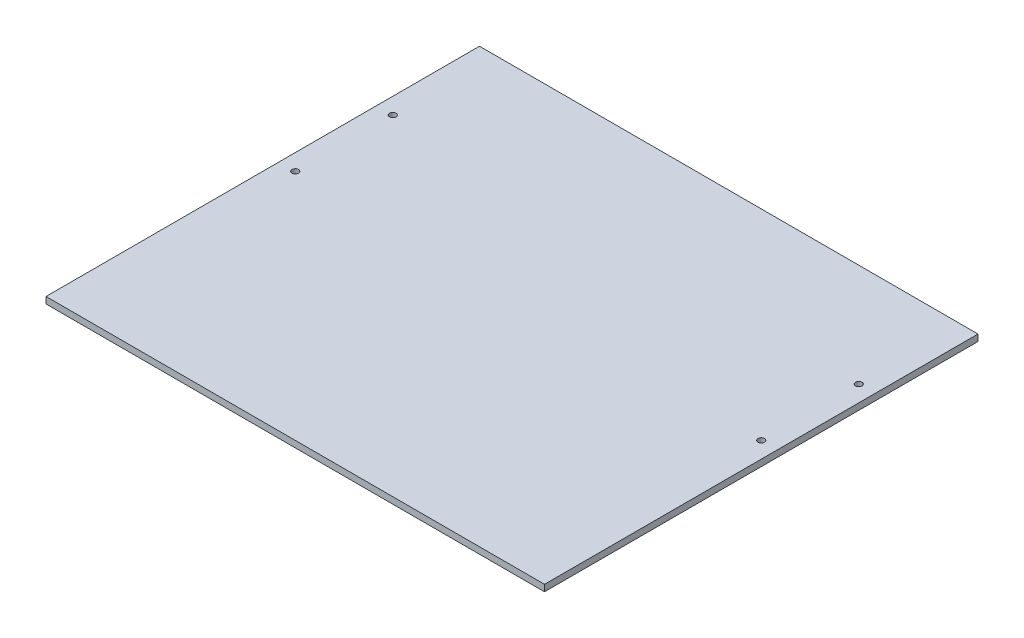
ISO-10303-21;
HEADER;
FILE_DESCRIPTION(('STEP AP214'),'2;1');
FILE_NAME('part.step','',(''),(''),'','','');
FILE_SCHEMA(('AUTOMOTIVE_DESIGN { 1 0 10303 214 1 1 1 1 }'));
ENDSEC;
DATA;
#1=APPLICATION_CONTEXT('core data for automotive mechanical design processes');
#2=APPLICATION_PROTOCOL_DEFINITION('international standard','automotive_design',2000,#1);
#3=PRODUCT_CONTEXT('',#1,'mechanical');
#4=PRODUCT('Part','Part','',(#3));
#5=PRODUCT_RELATED_PRODUCT_CATEGORY('part','',(#4));
#6=PRODUCT_DEFINITION_FORMATION('','',#4);
#7=PRODUCT_DEFINITION_CONTEXT('part definition',#1,'design');
#8=PRODUCT_DEFINITION('design','',#6,#7);
#9=PRODUCT_DEFINITION_SHAPE('','',#8);
#10=(LENGTH_UNIT() NAMED_UNIT(*) SI_UNIT(.MILLI.,.METRE.));
#11=(NAMED_UNIT(*) PLANE_ANGLE_UNIT() SI_UNIT($,.RADIAN.));
#12=(NAMED_UNIT(*) SI_UNIT($,.STERADIAN.) SOLID_ANGLE_UNIT());
#13=UNCERTAINTY_MEASURE_WITH_UNIT(LENGTH_MEASURE(1.E-05),#10,'distance_accuracy_value','');
#14=(GEOMETRIC_REPRESENTATION_CONTEXT(3) GLOBAL_UNCERTAINTY_ASSIGNED_CONTEXT((#13)) GLOBAL_UNIT_ASSIGNED_CONTEXT((#10,
#11,#12)) REPRESENTATION_CONTEXT('',''));
#15=CARTESIAN_POINT('',(0.,0.,0.));
#16=DIRECTION('',(0.,0.,1.));
#17=DIRECTION('',(1.,0.,0.));
#18=AXIS2_PLACEMENT_3D('',#15,#16,#17);
#19=CARTESIAN_POINT('',(0.,3.,0.));
#20=DIRECTION('',(0.,-1.,0.));
#21=DIRECTION('',(0.,0.,-1.));
#22=AXIS2_PLACEMENT_3D('',#19,#20,#21);
#23=PLANE('',#22);
#24=DIRECTION('',(0.,0.,-1.));
#25=VECTOR('',#24,1.);
#26=CARTESIAN_POINT('',(115.,3.,100.));
#27=LINE('',#26,#25);
#28=CARTESIAN_POINT('',(115.,3.,100.));
#29=VERTEX_POINT('',#28);
#30=CARTESIAN_POINT('',(115.,3.,-100.));
#31=VERTEX_POINT('',#30);
#32=EDGE_CURVE('E84',#29,#31,#27,.T.);
#33=ORIENTED_EDGE('',*,*,#32,.T.);
#34=DIRECTION('',(-1.,0.,0.));
#35=VECTOR('',#34,1.);
#36=CARTESIAN_POINT('',(-115.,3.,-100.));
#37=LINE('',#36,#35);
#38=CARTESIAN_POINT('',(-115.,3.,-100.));
#39=VERTEX_POINT('',#38);
#40=EDGE_CURVE('E79',#31,#39,#37,.T.);
#41=ORIENTED_EDGE('',*,*,#40,.T.);
#42=DIRECTION('',(0.,0.,1.));
#43=VECTOR('',#42,1.);
#44=CARTESIAN_POINT('',(-115.,3.,100.));
#45=LINE('',#44,#43);
#46=CARTESIAN_POINT('',(-115.,3.,100.));
#47=VERTEX_POINT('',#46);
#48=EDGE_CURVE('E82',#39,#47,#45,.T.);
#49=ORIENTED_EDGE('',*,*,#48,.T.);
#50=DIRECTION('',(1.,0.,0.));
#51=VECTOR('',#50,1.);
#52=CARTESIAN_POINT('',(-115.,3.,100.));
#53=LINE('',#52,#51);
#54=EDGE_CURVE('E49',#47,#29,#53,.T.);
#55=ORIENTED_EDGE('',*,*,#54,.T.);
#56=EDGE_LOOP('',(#33,#41,#49,#55));
#57=FACE_BOUND('',#56,.T.);
#58=CARTESIAN_POINT('',(-107.5,3.,-52.5));
#59=DIRECTION('',(0.,1.,0.));
#60=DIRECTION('',(0.,0.,1.));
#61=AXIS2_PLACEMENT_3D('',#58,#59,#60);
#62=CIRCLE('',#61,1.5);
#63=CARTESIAN_POINT('',(-107.5,3.,-51.));
#64=VERTEX_POINT('',#63);
#65=EDGE_CURVE('E99',#64,#64,#62,.T.);
#66=ORIENTED_EDGE('',*,*,#65,.F.);
#67=EDGE_LOOP('',(#66));
#68=FACE_BOUND('',#67,.T.);
#69=CARTESIAN_POINT('',(-107.5,3.,-7.49999999999997));
#70=DIRECTION('',(0.,1.,0.));
#71=DIRECTION('',(0.,0.,1.));
#72=AXIS2_PLACEMENT_3D('',#69,#70,#71);
#73=CIRCLE('',#72,1.5);
#74=CARTESIAN_POINT('',(-107.5,3.,-5.99999999999997));
#75=VERTEX_POINT('',#74);
#76=EDGE_CURVE('E114',#75,#75,#73,.T.);
#77=ORIENTED_EDGE('',*,*,#76,.F.);
#78=EDGE_LOOP('',(#77));
#79=FACE_BOUND('',#78,.T.);
#80=CARTESIAN_POINT('',(107.5,3.,-7.49999999999994));
#81=DIRECTION('',(0.,1.,0.));
#82=DIRECTION('',(0.,0.,-1.));
#83=AXIS2_PLACEMENT_3D('',#80,#81,#82);
#84=CIRCLE('',#83,1.5);
#85=CARTESIAN_POINT('',(107.5,3.,-8.99999999999994));
#86=VERTEX_POINT('',#85);
#87=EDGE_CURVE('E120',#86,#86,#84,.T.);
#88=ORIENTED_EDGE('',*,*,#87,.F.);
#89=EDGE_LOOP('',(#88));
#90=FACE_BOUND('',#89,.T.);
#91=CARTESIAN_POINT('',(107.5,3.,-52.5));
#92=DIRECTION('',(0.,1.,0.));
#93=DIRECTION('',(0.,0.,-1.));
#94=AXIS2_PLACEMENT_3D('',#91,#92,#93);
#95=CIRCLE('',#94,1.5);
#96=CARTESIAN_POINT('',(107.5,3.,-54.));
#97=VERTEX_POINT('',#96);
#98=EDGE_CURVE('E126',#97,#97,#95,.T.);
#99=ORIENTED_EDGE('',*,*,#98,.F.);
#100=EDGE_LOOP('',(#99));
#101=FACE_BOUND('',#100,.T.);
#102=ADVANCED_FACE('F32',(#57,#68,#79,#90,#101),#23,.F.);
#103=CARTESIAN_POINT('',(0.,0.,0.));
#104=DIRECTION('',(0.,-1.,0.));
#105=DIRECTION('',(0.,0.,-1.));
#106=AXIS2_PLACEMENT_3D('',#103,#104,#105);
#107=PLANE('',#106);
#108=CARTESIAN_POINT('',(107.5,0.,-7.49999999999994));
#109=DIRECTION('',(0.,1.,0.));
#110=DIRECTION('',(0.,0.,-1.));
#111=AXIS2_PLACEMENT_3D('',#108,#109,#110);
#112=CIRCLE('',#111,1.5);
#113=CARTESIAN_POINT('',(107.5,0.,-8.99999999999994));
#114=VERTEX_POINT('',#113);
#115=EDGE_CURVE('E123',#114,#114,#112,.T.);
#116=ORIENTED_EDGE('',*,*,#115,.T.);
#117=EDGE_LOOP('',(#116));
#118=FACE_BOUND('',#117,.T.);
#119=CARTESIAN_POINT('',(-107.5,0.,-52.5));
#120=DIRECTION('',(0.,1.,0.));
#121=DIRECTION('',(0.,0.,1.));
#122=AXIS2_PLACEMENT_3D('',#119,#120,#121);
#123=CIRCLE('',#122,1.5);
#124=CARTESIAN_POINT('',(-107.5,0.,-51.));
#125=VERTEX_POINT('',#124);
#126=EDGE_CURVE('E111',#125,#125,#123,.T.);
#127=ORIENTED_EDGE('',*,*,#126,.T.);
#128=EDGE_LOOP('',(#127));
#129=FACE_BOUND('',#128,.T.);
#130=DIRECTION('',(0.,0.,-1.));
#131=VECTOR('',#130,1.);
#132=CARTESIAN_POINT('',(115.,0.,100.));
#133=LINE('',#132,#131);
#134=CARTESIAN_POINT('',(115.,0.,100.));
#135=VERTEX_POINT('',#134);
#136=CARTESIAN_POINT('',(115.,0.,-100.));
#137=VERTEX_POINT('',#136);
#138=EDGE_CURVE('E96',#135,#137,#133,.T.);
#139=ORIENTED_EDGE('',*,*,#138,.F.);
#140=DIRECTION('',(1.,0.,0.));
#141=VECTOR('',#140,1.);
#142=CARTESIAN_POINT('',(-115.,0.,100.));
#143=LINE('',#142,#141);
#144=CARTESIAN_POINT('',(-115.,0.,100.));
#145=VERTEX_POINT('',#144);
#146=EDGE_CURVE('E72',#145,#135,#143,.T.);
#147=ORIENTED_EDGE('',*,*,#146,.F.);
#148=DIRECTION('',(0.,0.,1.));
#149=VECTOR('',#148,1.);
#150=CARTESIAN_POINT('',(-115.,0.,100.));
#151=LINE('',#150,#149);
#152=CARTESIAN_POINT('',(-115.,0.,-100.));
#153=VERTEX_POINT('',#152);
#154=EDGE_CURVE('E66',#153,#145,#151,.T.);
#155=ORIENTED_EDGE('',*,*,#154,.F.);
#156=DIRECTION('',(-1.,0.,0.));
#157=VECTOR('',#156,1.);
#158=CARTESIAN_POINT('',(-115.,0.,-100.));
#159=LINE('',#158,#157);
#160=EDGE_CURVE('E88',#137,#153,#159,.T.);
#161=ORIENTED_EDGE('',*,*,#160,.F.);
#162=EDGE_LOOP('',(#139,#147,#155,#161));
#163=FACE_BOUND('',#162,.T.);
#164=CARTESIAN_POINT('',(-107.5,0.,-7.49999999999997));
#165=DIRECTION('',(0.,1.,0.));
#166=DIRECTION('',(0.,0.,1.));
#167=AXIS2_PLACEMENT_3D('',#164,#165,#166);
#168=CIRCLE('',#167,1.5);
#169=CARTESIAN_POINT('',(-107.5,0.,-5.99999999999997));
#170=VERTEX_POINT('',#169);
#171=EDGE_CURVE('E117',#170,#170,#168,.T.);
#172=ORIENTED_EDGE('',*,*,#171,.T.);
#173=EDGE_LOOP('',(#172));
#174=FACE_BOUND('',#173,.T.);
#175=CARTESIAN_POINT('',(107.5,0.,-52.5));
#176=DIRECTION('',(0.,1.,0.));
#177=DIRECTION('',(0.,0.,-1.));
#178=AXIS2_PLACEMENT_3D('',#175,#176,#177);
#179=CIRCLE('',#178,1.5);
#180=CARTESIAN_POINT('',(107.5,0.,-54.));
#181=VERTEX_POINT('',#180);
#182=EDGE_CURVE('E129',#181,#181,#179,.T.);
#183=ORIENTED_EDGE('',*,*,#182,.T.);
#184=EDGE_LOOP('',(#183));
#185=FACE_BOUND('',#184,.T.);
#186=ADVANCED_FACE('F107',(#118,#129,#163,#174,#185),#107,.T.);
#187=CARTESIAN_POINT('',(115.,3.,100.));
#188=DIRECTION('',(-1.,0.,0.));
#189=DIRECTION('',(0.,0.,1.));
#190=AXIS2_PLACEMENT_3D('',#187,#188,#189);
#191=PLANE('',#190);
#192=ORIENTED_EDGE('',*,*,#138,.T.);
#193=DIRECTION('',(0.,-1.,0.));
#194=VECTOR('',#193,1.);
#195=CARTESIAN_POINT('',(115.,3.,-100.));
#196=LINE('',#195,#194);
#197=EDGE_CURVE('E11',#31,#137,#196,.T.);
#198=ORIENTED_EDGE('',*,*,#197,.F.);
#199=ORIENTED_EDGE('',*,*,#32,.F.);
#200=DIRECTION('',(0.,-1.,0.));
#201=VECTOR('',#200,1.);
#202=CARTESIAN_POINT('',(115.,3.,100.));
#203=LINE('',#202,#201);
#204=EDGE_CURVE('E92',#29,#135,#203,.T.);
#205=ORIENTED_EDGE('',*,*,#204,.T.);
#206=EDGE_LOOP('',(#192,#198,#199,#205));
#207=FACE_BOUND('',#206,.T.);
#208=ADVANCED_FACE('F34',(#207),#191,.F.);
#209=CARTESIAN_POINT('',(-115.,3.,-100.));
#210=DIRECTION('',(0.,0.,1.));
#211=DIRECTION('',(1.,0.,0.));
#212=AXIS2_PLACEMENT_3D('',#209,#210,#211);
#213=PLANE('',#212);
#214=ORIENTED_EDGE('',*,*,#160,.T.);
#215=DIRECTION('',(0.,-1.,0.));
#216=VECTOR('',#215,1.);
#217=CARTESIAN_POINT('',(-115.,3.,-100.));
#218=LINE('',#217,#216);
#219=EDGE_CURVE('E41',#39,#153,#218,.T.);
#220=ORIENTED_EDGE('',*,*,#219,.F.);
#221=ORIENTED_EDGE('',*,*,#40,.F.);
#222=ORIENTED_EDGE('',*,*,#197,.T.);
#223=EDGE_LOOP('',(#214,#220,#221,#222));
#224=FACE_BOUND('',#223,.T.);
#225=ADVANCED_FACE('F87',(#224),#213,.F.);
#226=CARTESIAN_POINT('',(-115.,3.,100.));
#227=DIRECTION('',(1.,0.,0.));
#228=DIRECTION('',(0.,0.,-1.));
#229=AXIS2_PLACEMENT_3D('',#226,#227,#228);
#230=PLANE('',#229);
#231=ORIENTED_EDGE('',*,*,#154,.T.);
#232=DIRECTION('',(0.,-1.,0.));
#233=VECTOR('',#232,1.);
#234=CARTESIAN_POINT('',(-115.,3.,100.));
#235=LINE('',#234,#233);
#236=EDGE_CURVE('E89',#47,#145,#235,.T.);
#237=ORIENTED_EDGE('',*,*,#236,.F.);
#238=ORIENTED_EDGE('',*,*,#48,.F.);
#239=ORIENTED_EDGE('',*,*,#219,.T.);
#240=EDGE_LOOP('',(#231,#237,#238,#239));
#241=FACE_BOUND('',#240,.T.);
#242=ADVANCED_FACE('F90',(#241),#230,.F.);
#243=CARTESIAN_POINT('',(-115.,3.,100.));
#244=DIRECTION('',(0.,0.,-1.));
#245=DIRECTION('',(-1.,0.,0.));
#246=AXIS2_PLACEMENT_3D('',#243,#244,#245);
#247=PLANE('',#246);
#248=ORIENTED_EDGE('',*,*,#146,.T.);
#249=ORIENTED_EDGE('',*,*,#204,.F.);
#250=ORIENTED_EDGE('',*,*,#54,.F.);
#251=ORIENTED_EDGE('',*,*,#236,.T.);
#252=EDGE_LOOP('',(#248,#249,#250,#251));
#253=FACE_BOUND('',#252,.T.);
#254=ADVANCED_FACE('F104',(#253),#247,.F.);
#255=CARTESIAN_POINT('',(-107.5,3.,-52.5));
#256=DIRECTION('',(0.,-1.,0.));
#257=DIRECTION('',(0.,0.,-1.));
#258=AXIS2_PLACEMENT_3D('',#255,#256,#257);
#259=CYLINDRICAL_SURFACE('',#258,1.5);
#260=ORIENTED_EDGE('',*,*,#65,.T.);
#261=EDGE_LOOP('',(#260));
#262=FACE_BOUND('',#261,.T.);
#263=ORIENTED_EDGE('',*,*,#126,.F.);
#264=EDGE_LOOP('',(#263));
#265=FACE_BOUND('',#264,.T.);
#266=ADVANCED_FACE('F146',(#262,#265),#259,.F.);
#267=CARTESIAN_POINT('',(-107.5,3.,-7.49999999999997));
#268=DIRECTION('',(0.,-1.,0.));
#269=DIRECTION('',(0.,0.,-1.));
#270=AXIS2_PLACEMENT_3D('',#267,#268,#269);
#271=CYLINDRICAL_SURFACE('',#270,1.5);
#272=ORIENTED_EDGE('',*,*,#76,.T.);
#273=EDGE_LOOP('',(#272));
#274=FACE_BOUND('',#273,.T.);
#275=ORIENTED_EDGE('',*,*,#171,.F.);
#276=EDGE_LOOP('',(#275));
#277=FACE_BOUND('',#276,.T.);
#278=ADVANCED_FACE('F192',(#274,#277),#271,.F.);
#279=CARTESIAN_POINT('',(107.5,3.,-7.49999999999994));
#280=DIRECTION('',(0.,-1.,0.));
#281=DIRECTION('',(0.,0.,-1.));
#282=AXIS2_PLACEMENT_3D('',#279,#280,#281);
#283=CYLINDRICAL_SURFACE('',#282,1.5);
#284=ORIENTED_EDGE('',*,*,#87,.T.);
#285=EDGE_LOOP('',(#284));
#286=FACE_BOUND('',#285,.T.);
#287=ORIENTED_EDGE('',*,*,#115,.F.);
#288=EDGE_LOOP('',(#287));
#289=FACE_BOUND('',#288,.T.);
#290=ADVANCED_FACE('F200',(#286,#289),#283,.F.);
#291=CARTESIAN_POINT('',(107.5,3.,-52.5));
#292=DIRECTION('',(0.,-1.,0.));
#293=DIRECTION('',(0.,0.,-1.));
#294=AXIS2_PLACEMENT_3D('',#291,#292,#293);
#295=CYLINDRICAL_SURFACE('',#294,1.5);
#296=ORIENTED_EDGE('',*,*,#98,.T.);
#297=EDGE_LOOP('',(#296));
#298=FACE_BOUND('',#297,.T.);
#299=ORIENTED_EDGE('',*,*,#182,.F.);
#300=EDGE_LOOP('',(#299));
#301=FACE_BOUND('',#300,.T.);
#302=ADVANCED_FACE('F135',(#298,#301),#295,.F.);
#303=CLOSED_SHELL('',(#102,#186,#208,#225,#242,#254,#266,#278,#290,#302));
#304=MANIFOLD_SOLID_BREP('B2',#303);
#305=ADVANCED_BREP_SHAPE_REPRESENTATION('',(#18,#304),#14);
#306=SHAPE_DEFINITION_REPRESENTATION(#9,#305);
ENDSEC;
END-ISO-10303-21;
